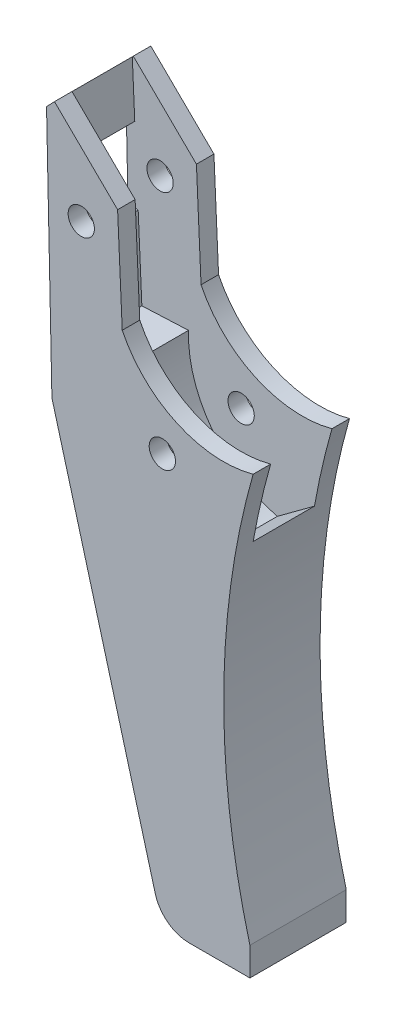
ISO-10303-21;
HEADER;
FILE_DESCRIPTION(('STEP AP214'),'2;1');
FILE_NAME('part.step','',(''),(''),'','','');
FILE_SCHEMA(('AUTOMOTIVE_DESIGN { 1 0 10303 214 1 1 1 1 }'));
ENDSEC;
DATA;
#1=APPLICATION_CONTEXT('core data for automotive mechanical design processes');
#2=APPLICATION_PROTOCOL_DEFINITION('international standard','automotive_design',2000,#1);
#3=PRODUCT_CONTEXT('',#1,'mechanical');
#4=PRODUCT('Part','Part','',(#3));
#5=PRODUCT_RELATED_PRODUCT_CATEGORY('part','',(#4));
#6=PRODUCT_DEFINITION_FORMATION('','',#4);
#7=PRODUCT_DEFINITION_CONTEXT('part definition',#1,'design');
#8=PRODUCT_DEFINITION('design','',#6,#7);
#9=PRODUCT_DEFINITION_SHAPE('','',#8);
#10=(LENGTH_UNIT() NAMED_UNIT(*) SI_UNIT(.MILLI.,.METRE.));
#11=(NAMED_UNIT(*) PLANE_ANGLE_UNIT() SI_UNIT($,.RADIAN.));
#12=(NAMED_UNIT(*) SI_UNIT($,.STERADIAN.) SOLID_ANGLE_UNIT());
#13=UNCERTAINTY_MEASURE_WITH_UNIT(LENGTH_MEASURE(1.E-05),#10,'distance_accuracy_value','');
#14=(GEOMETRIC_REPRESENTATION_CONTEXT(3) GLOBAL_UNCERTAINTY_ASSIGNED_CONTEXT((#13)) GLOBAL_UNIT_ASSIGNED_CONTEXT((#10,
#11,#12)) REPRESENTATION_CONTEXT('',''));
#15=CARTESIAN_POINT('',(0.,0.,0.));
#16=DIRECTION('',(0.,0.,1.));
#17=DIRECTION('',(1.,0.,0.));
#18=AXIS2_PLACEMENT_3D('',#15,#16,#17);
#19=CARTESIAN_POINT('',(-93.851998144766,-4.25439327758758,0.));
#20=DIRECTION('',(-0.998974136602221,-0.0452843725787139,0.));
#21=DIRECTION('',(0.0452843725787139,-0.998974136602221,0.));
#22=AXIS2_PLACEMENT_3D('',#19,#20,#21);
#23=PLANE('',#22);
#24=DIRECTION('',(0.,0.,-1.));
#25=VECTOR('',#24,1.);
#26=CARTESIAN_POINT('',(-92.0932753415327,-43.0518523972579,-6.98499999999999));
#27=LINE('',#26,#25);
#28=CARTESIAN_POINT('',(-92.0932753287063,-43.0518523932482,-11.43));
#29=VERTEX_POINT('',#28);
#30=CARTESIAN_POINT('',(-92.0932753416877,-43.0518523938367,-2.54));
#31=VERTEX_POINT('',#30);
#32=EDGE_CURVE('E12',#29,#31,#27,.F.);
#33=ORIENTED_EDGE('',*,*,#32,.F.);
#34=DIRECTION('',(-0.0452843725787139,0.998974136602221,0.));
#35=VECTOR('',#34,1.);
#36=CARTESIAN_POINT('',(-91.6881256823312,-51.9894617301897,-11.43));
#37=LINE('',#36,#35);
#38=CARTESIAN_POINT('',(-92.4528064360996,-35.1205894841561,-11.43));
#39=VERTEX_POINT('',#38);
#40=EDGE_CURVE('E260',#29,#39,#37,.T.);
#41=ORIENTED_EDGE('',*,*,#40,.T.);
#42=DIRECTION('',(0.,0.,-1.));
#43=VECTOR('',#42,1.);
#44=CARTESIAN_POINT('',(-92.4528064360996,-35.1205894841561,-13.97));
#45=LINE('',#44,#43);
#46=CARTESIAN_POINT('',(-92.4528064360996,-35.1205894841561,-2.54));
#47=VERTEX_POINT('',#46);
#48=EDGE_CURVE('E371',#39,#47,#45,.F.);
#49=ORIENTED_EDGE('',*,*,#48,.T.);
#50=DIRECTION('',(0.0452843725787139,-0.998974136602221,0.));
#51=VECTOR('',#50,1.);
#52=CARTESIAN_POINT('',(-91.6881256823312,-51.9894617301897,-2.54));
#53=LINE('',#52,#51);
#54=EDGE_CURVE('E261',#47,#31,#53,.T.);
#55=ORIENTED_EDGE('',*,*,#54,.T.);
#56=EDGE_LOOP('',(#33,#41,#49,#55));
#57=FACE_BOUND('',#56,.T.);
#58=ADVANCED_FACE('F36',(#57),#23,.F.);
#59=DIRECTION('',(0.,0.,-1.));
#60=VECTOR('',#59,1.);
#61=CARTESIAN_POINT('',(-91.5990378742872,-53.9547405019692,-6.98499999999999));
#62=LINE('',#61,#60);
#63=CARTESIAN_POINT('',(-91.5990378742848,-53.9547405019693,-2.54));
#64=VERTEX_POINT('',#63);
#65=CARTESIAN_POINT('',(-91.5990378742848,-53.9547405019693,-11.43));
#66=VERTEX_POINT('',#65);
#67=EDGE_CURVE('E45',#64,#66,#62,.T.);
#68=ORIENTED_EDGE('',*,*,#67,.F.);
#69=CARTESIAN_POINT('',(-91.0660692775769,-65.7120380732134,-2.54));
#70=VERTEX_POINT('',#69);
#71=EDGE_CURVE('E259',#64,#70,#53,.T.);
#72=ORIENTED_EDGE('',*,*,#71,.T.);
#73=DIRECTION('',(0.,0.,-1.));
#74=VECTOR('',#73,1.);
#75=CARTESIAN_POINT('',(-91.0660692775769,-65.7120380732134,-11.43));
#76=LINE('',#75,#74);
#77=CARTESIAN_POINT('',(-91.0660692775769,-65.7120380732134,-11.43));
#78=VERTEX_POINT('',#77);
#79=EDGE_CURVE('E263',#70,#78,#76,.T.);
#80=ORIENTED_EDGE('',*,*,#79,.T.);
#81=EDGE_CURVE('E256',#78,#66,#37,.T.);
#82=ORIENTED_EDGE('',*,*,#81,.T.);
#83=EDGE_LOOP('',(#68,#72,#80,#82));
#84=FACE_BOUND('',#83,.T.);
#85=ADVANCED_FACE('F393',(#84),#23,.F.);
#86=CARTESIAN_POINT('',(-93.5093838514776,-33.7907250637819,-13.97));
#87=DIRECTION('',(0.700655916393488,0.713499325033178,0.));
#88=DIRECTION('',(-0.713499325033178,0.700655916393488,0.));
#89=AXIS2_PLACEMENT_3D('',#86,#87,#88);
#90=PLANE('',#89);
#91=DIRECTION('',(-0.713499325033178,0.700655916393488,0.));
#92=VECTOR('',#91,1.);
#93=CARTESIAN_POINT('',(-93.5093838514776,-33.7907250637819,-13.97));
#94=LINE('',#93,#92);
#95=CARTESIAN_POINT('',(-83.1529453065732,-43.9607416071269,-13.97));
#96=VERTEX_POINT('',#95);
#97=CARTESIAN_POINT('',(-92.3085324636097,-34.9699604184613,-13.97));
#98=VERTEX_POINT('',#97);
#99=EDGE_CURVE('E302',#96,#98,#94,.T.);
#100=ORIENTED_EDGE('',*,*,#99,.T.);
#101=DIRECTION('',(0.,0.,1.));
#102=VECTOR('',#101,1.);
#103=CARTESIAN_POINT('',(-92.3085324636097,-34.9699604184613,-13.97));
#104=LINE('',#103,#102);
#105=CARTESIAN_POINT('',(-92.3085324636097,-34.9699604184613,-11.43));
#106=VERTEX_POINT('',#105);
#107=EDGE_CURVE('E365',#98,#106,#104,.T.);
#108=ORIENTED_EDGE('',*,*,#107,.T.);
#109=DIRECTION('',(-0.713499325033178,0.700655916393488,0.));
#110=VECTOR('',#109,1.);
#111=CARTESIAN_POINT('',(-93.5093838514776,-33.7907250637819,-11.43));
#112=LINE('',#111,#110);
#113=CARTESIAN_POINT('',(-83.1529453065732,-43.9607416071269,-11.43));
#114=VERTEX_POINT('',#113);
#115=EDGE_CURVE('E247',#114,#106,#112,.T.);
#116=ORIENTED_EDGE('',*,*,#115,.F.);
#117=DIRECTION('',(0.,0.,1.));
#118=VECTOR('',#117,1.);
#119=CARTESIAN_POINT('',(-83.1529453065732,-43.9607416071269,-13.97));
#120=LINE('',#119,#118);
#121=EDGE_CURVE('E340',#96,#114,#120,.T.);
#122=ORIENTED_EDGE('',*,*,#121,.F.);
#123=EDGE_LOOP('',(#100,#108,#116,#122));
#124=FACE_BOUND('',#123,.T.);
#125=ADVANCED_FACE('F426',(#124),#90,.T.);
#126=CARTESIAN_POINT('',(-67.7974577544725,-51.5892197136728,-13.97));
#127=DIRECTION('',(0.,0.,1.));
#128=DIRECTION('',(1.,0.,0.));
#129=AXIS2_PLACEMENT_3D('',#126,#127,#128);
#130=CYLINDRICAL_SURFACE('',#129,16.3454628496922);
#131=DIRECTION('',(0.,0.,1.));
#132=VECTOR('',#131,1.);
#133=CARTESIAN_POINT('',(-82.4816784910541,-58.7689005652159,-13.97));
#134=LINE('',#133,#132);
#135=CARTESIAN_POINT('',(-82.4816784910541,-58.7689005652159,-13.97));
#136=VERTEX_POINT('',#135);
#137=CARTESIAN_POINT('',(-82.4816784910541,-58.7689005652159,-11.43));
#138=VERTEX_POINT('',#137);
#139=EDGE_CURVE('E344',#136,#138,#134,.T.);
#140=ORIENTED_EDGE('',*,*,#139,.T.);
#141=CARTESIAN_POINT('',(-67.7974577544725,-51.5892197136728,-11.43));
#142=DIRECTION('',(0.,0.,1.));
#143=DIRECTION('',(1.,0.,0.));
#144=AXIS2_PLACEMENT_3D('',#141,#142,#143);
#145=CIRCLE('',#144,16.3454628496922);
#146=CARTESIAN_POINT('',(-63.5,-67.3596354538868,-11.43));
#147=VERTEX_POINT('',#146);
#148=EDGE_CURVE('E232',#138,#147,#145,.T.);
#149=ORIENTED_EDGE('',*,*,#148,.T.);
#150=DIRECTION('',(0.,0.,1.));
#151=VECTOR('',#150,1.);
#152=CARTESIAN_POINT('',(-63.5,-67.3596354538868,-13.97));
#153=LINE('',#152,#151);
#154=CARTESIAN_POINT('',(-63.5,-67.3596354538868,-13.97));
#155=VERTEX_POINT('',#154);
#156=EDGE_CURVE('E348',#155,#147,#153,.T.);
#157=ORIENTED_EDGE('',*,*,#156,.F.);
#158=CARTESIAN_POINT('',(-67.7974577544725,-51.5892197136728,-13.97));
#159=DIRECTION('',(0.,0.,-1.));
#160=DIRECTION('',(-1.,0.,0.));
#161=AXIS2_PLACEMENT_3D('',#158,#159,#160);
#162=CIRCLE('',#161,16.3454628496922);
#163=EDGE_CURVE('E296',#155,#136,#162,.T.);
#164=ORIENTED_EDGE('',*,*,#163,.T.);
#165=EDGE_LOOP('',(#140,#149,#157,#164));
#166=FACE_BOUND('',#165,.T.);
#167=ADVANCED_FACE('F413',(#166),#130,.F.);
#168=CARTESIAN_POINT('',(43.7733812356117,-97.8979837956197,-13.97));
#169=DIRECTION('',(0.,0.,1.));
#170=DIRECTION('',(1.,0.,0.));
#171=AXIS2_PLACEMENT_3D('',#168,#169,#170);
#172=CYLINDRICAL_SURFACE('',#171,111.535505742171);
#173=ORIENTED_EDGE('',*,*,#156,.T.);
#174=CARTESIAN_POINT('',(43.7733812356117,-97.8979837956197,-11.43));
#175=DIRECTION('',(0.,0.,1.));
#176=DIRECTION('',(1.,0.,0.));
#177=AXIS2_PLACEMENT_3D('',#174,#175,#176);
#178=CIRCLE('',#177,111.535505742171);
#179=CARTESIAN_POINT('',(-66.0356185174837,-78.3492596841434,-11.43));
#180=VERTEX_POINT('',#179);
#181=EDGE_CURVE('E235',#147,#180,#178,.T.);
#182=ORIENTED_EDGE('',*,*,#181,.T.);
#183=DIRECTION('',(0.,0.,1.));
#184=VECTOR('',#183,1.);
#185=CARTESIAN_POINT('',(-66.0356185174837,-78.3492596841434,-13.97));
#186=LINE('',#185,#184);
#187=CARTESIAN_POINT('',(-66.0356185174837,-78.3492596841434,-2.54));
#188=VERTEX_POINT('',#187);
#189=EDGE_CURVE('E336',#188,#180,#186,.F.);
#190=ORIENTED_EDGE('',*,*,#189,.F.);
#191=CARTESIAN_POINT('',(43.7733812356117,-97.8979837956197,-2.54));
#192=DIRECTION('',(0.,0.,1.));
#193=DIRECTION('',(1.,0.,0.));
#194=AXIS2_PLACEMENT_3D('',#191,#192,#193);
#195=CIRCLE('',#194,111.535505742171);
#196=CARTESIAN_POINT('',(-63.5,-67.3596354538868,-2.54));
#197=VERTEX_POINT('',#196);
#198=EDGE_CURVE('E227',#197,#188,#195,.T.);
#199=ORIENTED_EDGE('',*,*,#198,.F.);
#200=CARTESIAN_POINT('',(-63.5,-67.3596354538868,0.));
#201=VERTEX_POINT('',#200);
#202=EDGE_CURVE('E351',#197,#201,#153,.T.);
#203=ORIENTED_EDGE('',*,*,#202,.T.);
#204=CARTESIAN_POINT('',(43.7733812356117,-97.8979837956197,0.));
#205=DIRECTION('',(0.,0.,-1.));
#206=DIRECTION('',(-1.,0.,0.));
#207=AXIS2_PLACEMENT_3D('',#204,#205,#206);
#208=CIRCLE('',#207,111.535505742171);
#209=CARTESIAN_POINT('',(-63.9670604737335,-126.745275894482,0.));
#210=VERTEX_POINT('',#209);
#211=EDGE_CURVE('E315',#210,#201,#208,.T.);
#212=ORIENTED_EDGE('',*,*,#211,.F.);
#213=DIRECTION('',(0.,0.,1.));
#214=VECTOR('',#213,1.);
#215=CARTESIAN_POINT('',(-63.9670604737335,-126.745275894482,-13.97));
#216=LINE('',#215,#214);
#217=CARTESIAN_POINT('',(-63.9670604737335,-126.745275894482,-13.97));
#218=VERTEX_POINT('',#217);
#219=EDGE_CURVE('E312',#218,#210,#216,.T.);
#220=ORIENTED_EDGE('',*,*,#219,.F.);
#221=CARTESIAN_POINT('',(43.7733812356117,-97.8979837956197,-13.97));
#222=DIRECTION('',(0.,0.,-1.));
#223=DIRECTION('',(-1.,0.,0.));
#224=AXIS2_PLACEMENT_3D('',#221,#222,#223);
#225=CIRCLE('',#224,111.535505742171);
#226=EDGE_CURVE('E292',#218,#155,#225,.T.);
#227=ORIENTED_EDGE('',*,*,#226,.T.);
#228=EDGE_LOOP('',(#173,#182,#190,#199,#203,#212,#220,#227));
#229=FACE_BOUND('',#228,.T.);
#230=ADVANCED_FACE('F409',(#229),#172,.F.);
#231=CARTESIAN_POINT('',(-76.6670604737335,-71.3707090497414,-13.97));
#232=DIRECTION('',(0.,0.,1.));
#233=DIRECTION('',(1.,0.,0.));
#234=AXIS2_PLACEMENT_3D('',#231,#232,#233);
#235=CYLINDRICAL_SURFACE('',#234,1.90500000000001);
#236=CARTESIAN_POINT('',(-76.6670604737335,-71.3707090497414,-13.97));
#237=DIRECTION('',(0.,0.,1.));
#238=DIRECTION('',(1.,0.,0.));
#239=AXIS2_PLACEMENT_3D('',#236,#237,#238);
#240=CIRCLE('',#239,1.90500000000001);
#241=CARTESIAN_POINT('',(-74.7620604737335,-71.3707090497414,-13.97));
#242=VERTEX_POINT('',#241);
#243=EDGE_CURVE('E283',#242,#242,#240,.T.);
#244=ORIENTED_EDGE('',*,*,#243,.F.);
#245=EDGE_LOOP('',(#244));
#246=FACE_BOUND('',#245,.T.);
#247=CARTESIAN_POINT('',(-76.6670604737335,-71.3707090497414,-11.43));
#248=DIRECTION('',(0.,0.,1.));
#249=DIRECTION('',(1.,0.,0.));
#250=AXIS2_PLACEMENT_3D('',#247,#248,#249);
#251=CIRCLE('',#250,1.90500000000001);
#252=CARTESIAN_POINT('',(-74.7620604737335,-71.3707090497414,-11.43));
#253=VERTEX_POINT('',#252);
#254=EDGE_CURVE('E238',#253,#253,#251,.F.);
#255=ORIENTED_EDGE('',*,*,#254,.F.);
#256=EDGE_LOOP('',(#255));
#257=FACE_BOUND('',#256,.T.);
#258=ADVANCED_FACE('F506',(#246,#257),#235,.F.);
#259=CARTESIAN_POINT('',(-83.1529453065732,-43.9607416071269,-13.97));
#260=DIRECTION('',(0.998974136602221,0.0452843725787153,0.));
#261=DIRECTION('',(-0.0452843725787153,0.998974136602221,0.));
#262=AXIS2_PLACEMENT_3D('',#259,#260,#261);
#263=PLANE('',#262);
#264=DIRECTION('',(0.0452843725787139,-0.998974136602221,0.));
#265=VECTOR('',#264,1.);
#266=CARTESIAN_POINT('',(-82.8072456079375,-51.5868836579649,-2.54));
#267=LINE('',#266,#265);
#268=CARTESIAN_POINT('',(-83.1529453065732,-43.9607416071269,-2.54));
#269=VERTEX_POINT('',#268);
#270=CARTESIAN_POINT('',(-82.4816784910541,-58.7689005652159,-2.54));
#271=VERTEX_POINT('',#270);
#272=EDGE_CURVE('E268',#269,#271,#267,.T.);
#273=ORIENTED_EDGE('',*,*,#272,.F.);
#274=CARTESIAN_POINT('',(-83.1529453065732,-43.9607416071269,0.));
#275=VERTEX_POINT('',#274);
#276=EDGE_CURVE('E343',#269,#275,#120,.T.);
#277=ORIENTED_EDGE('',*,*,#276,.T.);
#278=DIRECTION('',(-0.0452843725787153,0.998974136602221,0.));
#279=VECTOR('',#278,1.);
#280=CARTESIAN_POINT('',(-83.1529453065732,-43.9607416071269,0.));
#281=LINE('',#280,#279);
#282=CARTESIAN_POINT('',(-82.4816784910541,-58.7689005652159,0.));
#283=VERTEX_POINT('',#282);
#284=EDGE_CURVE('E321',#283,#275,#281,.T.);
#285=ORIENTED_EDGE('',*,*,#284,.F.);
#286=EDGE_CURVE('E347',#271,#283,#134,.T.);
#287=ORIENTED_EDGE('',*,*,#286,.F.);
#288=EDGE_LOOP('',(#273,#277,#285,#287));
#289=FACE_BOUND('',#288,.T.);
#290=ADVANCED_FACE('F449',(#289),#263,.T.);
#291=CARTESIAN_POINT('',(-88.4240724531365,-48.0537853711645,-13.97));
#292=DIRECTION('',(0.,0.,1.));
#293=DIRECTION('',(1.,0.,0.));
#294=AXIS2_PLACEMENT_3D('',#291,#292,#293);
#295=CYLINDRICAL_SURFACE('',#294,1.90500000000001);
#296=CARTESIAN_POINT('',(-88.4240724531365,-48.0537853711645,-2.54));
#297=DIRECTION('',(0.,0.,1.));
#298=DIRECTION('',(1.,0.,0.));
#299=AXIS2_PLACEMENT_3D('',#296,#297,#298);
#300=CIRCLE('',#299,1.90500000000001);
#301=CARTESIAN_POINT('',(-86.5190724531365,-48.0537853711645,-2.54));
#302=VERTEX_POINT('',#301);
#303=EDGE_CURVE('E250',#302,#302,#300,.F.);
#304=ORIENTED_EDGE('',*,*,#303,.T.);
#305=EDGE_LOOP('',(#304));
#306=FACE_BOUND('',#305,.T.);
#307=CARTESIAN_POINT('',(-88.4240724531365,-48.0537853711645,0.));
#308=DIRECTION('',(0.,0.,1.));
#309=DIRECTION('',(1.,0.,0.));
#310=AXIS2_PLACEMENT_3D('',#307,#308,#309);
#311=CIRCLE('',#310,1.90500000000001);
#312=CARTESIAN_POINT('',(-86.5190724531365,-48.0537853711645,0.));
#313=VERTEX_POINT('',#312);
#314=EDGE_CURVE('E274',#313,#313,#311,.T.);
#315=ORIENTED_EDGE('',*,*,#314,.T.);
#316=EDGE_LOOP('',(#315));
#317=FACE_BOUND('',#316,.T.);
#318=ADVANCED_FACE('F502',(#306,#317),#295,.F.);
#319=CARTESIAN_POINT('',(-63.9670604737335,-130.859635453887,-13.97));
#320=DIRECTION('',(1.,0.,0.));
#321=DIRECTION('',(0.,0.,-1.));
#322=AXIS2_PLACEMENT_3D('',#319,#320,#321);
#323=PLANE('',#322);
#324=DIRECTION('',(0.,1.,0.));
#325=VECTOR('',#324,1.);
#326=CARTESIAN_POINT('',(-63.9670604737335,-130.859635453887,0.));
#327=LINE('',#326,#325);
#328=CARTESIAN_POINT('',(-63.9670604737335,-130.859635453887,0.));
#329=VERTEX_POINT('',#328);
#330=EDGE_CURVE('E286',#329,#210,#327,.T.);
#331=ORIENTED_EDGE('',*,*,#330,.F.);
#332=DIRECTION('',(0.,0.,1.));
#333=VECTOR('',#332,1.);
#334=CARTESIAN_POINT('',(-63.9670604737335,-130.859635453887,-13.97));
#335=LINE('',#334,#333);
#336=CARTESIAN_POINT('',(-63.9670604737335,-130.859635453887,-13.97));
#337=VERTEX_POINT('',#336);
#338=EDGE_CURVE('E333',#337,#329,#335,.T.);
#339=ORIENTED_EDGE('',*,*,#338,.F.);
#340=DIRECTION('',(0.,1.,0.));
#341=VECTOR('',#340,1.);
#342=CARTESIAN_POINT('',(-63.9670604737335,-130.859635453887,-13.97));
#343=LINE('',#342,#341);
#344=EDGE_CURVE('E289',#337,#218,#343,.T.);
#345=ORIENTED_EDGE('',*,*,#344,.T.);
#346=ORIENTED_EDGE('',*,*,#219,.T.);
#347=EDGE_LOOP('',(#331,#339,#345,#346));
#348=FACE_BOUND('',#347,.T.);
#349=ADVANCED_FACE('F457',(#348),#323,.T.);
#350=CARTESIAN_POINT('',(-63.9670604737335,-130.859635453887,-13.97));
#351=DIRECTION('',(0.,-1.,0.));
#352=DIRECTION('',(0.,0.,-1.));
#353=AXIS2_PLACEMENT_3D('',#350,#351,#352);
#354=PLANE('',#353);
#355=DIRECTION('',(1.,0.,0.));
#356=VECTOR('',#355,1.);
#357=CARTESIAN_POINT('',(-63.9670604737335,-130.859635453887,0.));
#358=LINE('',#357,#356);
#359=CARTESIAN_POINT('',(-72.790672129976,-130.859635453887,0.));
#360=VERTEX_POINT('',#359);
#361=EDGE_CURVE('E293',#360,#329,#358,.T.);
#362=ORIENTED_EDGE('',*,*,#361,.F.);
#363=DIRECTION('',(0.,0.,1.));
#364=VECTOR('',#363,1.);
#365=CARTESIAN_POINT('',(-72.790672129976,-130.859635453887,-13.97));
#366=LINE('',#365,#364);
#367=CARTESIAN_POINT('',(-72.790672129976,-130.859635453887,-13.97));
#368=VERTEX_POINT('',#367);
#369=EDGE_CURVE('E359',#360,#368,#366,.F.);
#370=ORIENTED_EDGE('',*,*,#369,.T.);
#371=DIRECTION('',(1.,0.,0.));
#372=VECTOR('',#371,1.);
#373=CARTESIAN_POINT('',(-63.9670604737335,-130.859635453887,-13.97));
#374=LINE('',#373,#372);
#375=EDGE_CURVE('E310',#368,#337,#374,.T.);
#376=ORIENTED_EDGE('',*,*,#375,.T.);
#377=ORIENTED_EDGE('',*,*,#338,.T.);
#378=EDGE_LOOP('',(#362,#370,#376,#377));
#379=FACE_BOUND('',#378,.T.);
#380=ADVANCED_FACE('F480',(#379),#354,.T.);
#381=CARTESIAN_POINT('',(-76.6670604737335,-130.859635453887,-13.97));
#382=DIRECTION('',(-0.96452162245179,-0.264003863272805,0.));
#383=DIRECTION('',(0.264003863272805,-0.96452162245179,0.));
#384=AXIS2_PLACEMENT_3D('',#381,#382,#383);
#385=PLANE('',#384);
#386=DIRECTION('',(0.264003863272805,-0.96452162245179,0.));
#387=VECTOR('',#386,1.);
#388=CARTESIAN_POINT('',(-76.6670604737335,-130.859635453887,-13.97));
#389=LINE('',#388,#387);
#390=CARTESIAN_POINT('',(-92.6781347904369,-72.3641756310693,-13.97));
#391=VERTEX_POINT('',#390);
#392=CARTESIAN_POINT('',(-77.6904419720311,-127.120775079313,-13.97));
#393=VERTEX_POINT('',#392);
#394=EDGE_CURVE('E307',#391,#393,#389,.T.);
#395=ORIENTED_EDGE('',*,*,#394,.T.);
#396=DIRECTION('',(0.,0.,1.));
#397=VECTOR('',#396,1.);
#398=CARTESIAN_POINT('',(-77.6904419720311,-127.120775079313,-13.97));
#399=LINE('',#398,#397);
#400=CARTESIAN_POINT('',(-77.6904419720311,-127.120775079313,0.));
#401=VERTEX_POINT('',#400);
#402=EDGE_CURVE('E354',#393,#401,#399,.T.);
#403=ORIENTED_EDGE('',*,*,#402,.T.);
#404=DIRECTION('',(0.264003863272805,-0.96452162245179,0.));
#405=VECTOR('',#404,1.);
#406=CARTESIAN_POINT('',(-76.6670604737335,-130.859635453887,0.));
#407=LINE('',#406,#405);
#408=CARTESIAN_POINT('',(-92.6781347904369,-72.3641756310693,0.));
#409=VERTEX_POINT('',#408);
#410=EDGE_CURVE('E329',#409,#401,#407,.T.);
#411=ORIENTED_EDGE('',*,*,#410,.F.);
#412=DIRECTION('',(0.,0.,1.));
#413=VECTOR('',#412,1.);
#414=CARTESIAN_POINT('',(-92.6781347904369,-72.3641756310693,-13.97));
#415=LINE('',#414,#413);
#416=EDGE_CURVE('E337',#391,#409,#415,.T.);
#417=ORIENTED_EDGE('',*,*,#416,.F.);
#418=EDGE_LOOP('',(#395,#403,#411,#417));
#419=FACE_BOUND('',#418,.T.);
#420=ADVANCED_FACE('F469',(#419),#385,.T.);
#421=CARTESIAN_POINT('',(-92.6781347904369,-72.3641756310693,-13.97));
#422=DIRECTION('',(-0.999767884506996,-0.0215447698619914,0.));
#423=DIRECTION('',(0.0215447698619914,-0.999767884506996,0.));
#424=AXIS2_PLACEMENT_3D('',#421,#422,#423);
#425=PLANE('',#424);
#426=DIRECTION('',(0.0215447698619914,-0.999767884506996,0.));
#427=VECTOR('',#426,1.);
#428=CARTESIAN_POINT('',(-92.6781347904369,-72.3641756310693,-11.43));
#429=LINE('',#428,#427);
#430=CARTESIAN_POINT('',(-93.2909177776818,-43.9284688969299,-11.43));
#431=VERTEX_POINT('',#430);
#432=CARTESIAN_POINT('',(-93.092711695722,-53.126064124241,-11.43));
#433=VERTEX_POINT('',#432);
#434=EDGE_CURVE('E195',#431,#433,#429,.T.);
#435=ORIENTED_EDGE('',*,*,#434,.F.);
#436=DIRECTION('',(0.,0.,-1.));
#437=VECTOR('',#436,1.);
#438=CARTESIAN_POINT('',(-93.2909177841511,-43.9284689044784,-6.98499999999999));
#439=LINE('',#438,#437);
#440=CARTESIAN_POINT('',(-93.2909177776818,-43.9284688969299,-2.54));
#441=VERTEX_POINT('',#440);
#442=EDGE_CURVE('E199',#431,#441,#439,.F.);
#443=ORIENTED_EDGE('',*,*,#442,.T.);
#444=DIRECTION('',(-0.0215447698619914,0.999767884506996,0.));
#445=VECTOR('',#444,1.);
#446=CARTESIAN_POINT('',(-92.6781347904369,-72.3641756310693,-2.54));
#447=LINE('',#446,#445);
#448=CARTESIAN_POINT('',(-93.0927117051514,-53.1260641244442,-2.54));
#449=VERTEX_POINT('',#448);
#450=EDGE_CURVE('E189',#449,#441,#447,.T.);
#451=ORIENTED_EDGE('',*,*,#450,.F.);
#452=DIRECTION('',(0.,0.,-1.));
#453=VECTOR('',#452,1.);
#454=CARTESIAN_POINT('',(-93.09271170537,-53.1260641143017,-6.98499999999999));
#455=LINE('',#454,#453);
#456=EDGE_CURVE('E208',#449,#433,#455,.T.);
#457=ORIENTED_EDGE('',*,*,#456,.T.);
#458=EDGE_LOOP('',(#435,#443,#451,#457));
#459=FACE_BOUND('',#458,.T.);
#460=DIRECTION('',(0.0215447698619914,-0.999767884506996,0.));
#461=VECTOR('',#460,1.);
#462=CARTESIAN_POINT('',(-92.6781347904369,-72.3641756310693,0.));
#463=LINE('',#462,#461);
#464=CARTESIAN_POINT('',(-93.4581072992061,-36.1701726289086,0.));
#465=VERTEX_POINT('',#464);
#466=EDGE_CURVE('E327',#465,#409,#463,.T.);
#467=ORIENTED_EDGE('',*,*,#466,.F.);
#468=DIRECTION('',(0.,0.,-1.));
#469=VECTOR('',#468,1.);
#470=CARTESIAN_POINT('',(-93.4581072992061,-36.1701726289086,-13.97));
#471=LINE('',#470,#469);
#472=CARTESIAN_POINT('',(-93.4581072992061,-36.1701726289086,-13.97));
#473=VERTEX_POINT('',#472);
#474=EDGE_CURVE('E377',#465,#473,#471,.T.);
#475=ORIENTED_EDGE('',*,*,#474,.T.);
#476=DIRECTION('',(0.0215447698619914,-0.999767884506996,0.));
#477=VECTOR('',#476,1.);
#478=CARTESIAN_POINT('',(-92.6781347904369,-72.3641756310693,-13.97));
#479=LINE('',#478,#477);
#480=EDGE_CURVE('E305',#473,#391,#479,.T.);
#481=ORIENTED_EDGE('',*,*,#480,.T.);
#482=ORIENTED_EDGE('',*,*,#416,.T.);
#483=EDGE_LOOP('',(#467,#475,#481,#482));
#484=FACE_BOUND('',#483,.T.);
#485=ADVANCED_FACE('F205',(#459,#484),#425,.T.);
#486=DIRECTION('',(0.713499325033178,-0.700655916393488,0.));
#487=VECTOR('',#486,1.);
#488=CARTESIAN_POINT('',(-93.5093838514776,-33.7907250637819,-2.54));
#489=LINE('',#488,#487);
#490=CARTESIAN_POINT('',(-92.3085324636097,-34.9699604184613,-2.54));
#491=VERTEX_POINT('',#490);
#492=EDGE_CURVE('E253',#491,#269,#489,.T.);
#493=ORIENTED_EDGE('',*,*,#492,.F.);
#494=DIRECTION('',(0.,0.,1.));
#495=VECTOR('',#494,1.);
#496=CARTESIAN_POINT('',(-92.3085324636097,-34.9699604184613,-13.97));
#497=LINE('',#496,#495);
#498=CARTESIAN_POINT('',(-92.3085324636097,-34.9699604184613,0.));
#499=VERTEX_POINT('',#498);
#500=EDGE_CURVE('E363',#491,#499,#497,.T.);
#501=ORIENTED_EDGE('',*,*,#500,.T.);
#502=DIRECTION('',(-0.713499325033178,0.700655916393488,0.));
#503=VECTOR('',#502,1.);
#504=CARTESIAN_POINT('',(-93.5093838514776,-33.7907250637819,0.));
#505=LINE('',#504,#503);
#506=EDGE_CURVE('E324',#275,#499,#505,.T.);
#507=ORIENTED_EDGE('',*,*,#506,.F.);
#508=ORIENTED_EDGE('',*,*,#276,.F.);
#509=EDGE_LOOP('',(#493,#501,#507,#508));
#510=FACE_BOUND('',#509,.T.);
#511=ADVANCED_FACE('F439',(#510),#90,.T.);
#512=ORIENTED_EDGE('',*,*,#121,.T.);
#513=DIRECTION('',(-0.0452843725787139,0.998974136602221,0.));
#514=VECTOR('',#513,1.);
#515=CARTESIAN_POINT('',(-82.8072456079375,-51.5868836579649,-11.43));
#516=LINE('',#515,#514);
#517=EDGE_CURVE('E255',#138,#114,#516,.T.);
#518=ORIENTED_EDGE('',*,*,#517,.F.);
#519=ORIENTED_EDGE('',*,*,#139,.F.);
#520=DIRECTION('',(-0.0452843725787153,0.998974136602221,0.));
#521=VECTOR('',#520,1.);
#522=CARTESIAN_POINT('',(-83.1529453065732,-43.9607416071269,-13.97));
#523=LINE('',#522,#521);
#524=EDGE_CURVE('E299',#136,#96,#523,.T.);
#525=ORIENTED_EDGE('',*,*,#524,.T.);
#526=EDGE_LOOP('',(#512,#518,#519,#525));
#527=FACE_BOUND('',#526,.T.);
#528=ADVANCED_FACE('F417',(#527),#263,.T.);
#529=CARTESIAN_POINT('',(-67.7974577544725,-51.5892197136728,-2.54));
#530=DIRECTION('',(0.,0.,1.));
#531=DIRECTION('',(1.,0.,0.));
#532=AXIS2_PLACEMENT_3D('',#529,#530,#531);
#533=CIRCLE('',#532,16.3454628496922);
#534=EDGE_CURVE('E225',#271,#197,#533,.T.);
#535=ORIENTED_EDGE('',*,*,#534,.F.);
#536=ORIENTED_EDGE('',*,*,#286,.T.);
#537=CARTESIAN_POINT('',(-67.7974577544725,-51.5892197136728,0.));
#538=DIRECTION('',(0.,0.,-1.));
#539=DIRECTION('',(-1.,0.,0.));
#540=AXIS2_PLACEMENT_3D('',#537,#538,#539);
#541=CIRCLE('',#540,16.3454628496922);
#542=EDGE_CURVE('E318',#201,#283,#541,.T.);
#543=ORIENTED_EDGE('',*,*,#542,.F.);
#544=ORIENTED_EDGE('',*,*,#202,.F.);
#545=EDGE_LOOP('',(#535,#536,#543,#544));
#546=FACE_BOUND('',#545,.T.);
#547=ADVANCED_FACE('F451',(#546),#130,.F.);
#548=CARTESIAN_POINT('',(43.7733812356117,-97.8979837956197,-13.97));
#549=DIRECTION('',(0.,0.,-1.));
#550=DIRECTION('',(-1.,0.,0.));
#551=AXIS2_PLACEMENT_3D('',#548,#549,#550);
#552=PLANE('',#551);
#553=CARTESIAN_POINT('',(-88.4240724531365,-48.0537853711645,-13.97));
#554=DIRECTION('',(0.,0.,1.));
#555=DIRECTION('',(1.,0.,0.));
#556=AXIS2_PLACEMENT_3D('',#553,#554,#555);
#557=CIRCLE('',#556,1.90500000000001);
#558=CARTESIAN_POINT('',(-86.5190724531365,-48.0537853711645,-13.97));
#559=VERTEX_POINT('',#558);
#560=EDGE_CURVE('E277',#559,#559,#557,.T.);
#561=ORIENTED_EDGE('',*,*,#560,.T.);
#562=EDGE_LOOP('',(#561));
#563=FACE_BOUND('',#562,.T.);
#564=ORIENTED_EDGE('',*,*,#243,.T.);
#565=EDGE_LOOP('',(#564));
#566=FACE_BOUND('',#565,.T.);
#567=ORIENTED_EDGE('',*,*,#480,.F.);
#568=DIRECTION('',(-0.691708197878913,-0.722177103615939,0.));
#569=VECTOR('',#568,1.);
#570=CARTESIAN_POINT('',(-58.6335505390539,0.188363547003689,-13.97));
#571=LINE('',#570,#569);
#572=EDGE_CURVE('E379',#473,#98,#571,.F.);
#573=ORIENTED_EDGE('',*,*,#572,.T.);
#574=ORIENTED_EDGE('',*,*,#99,.F.);
#575=ORIENTED_EDGE('',*,*,#524,.F.);
#576=ORIENTED_EDGE('',*,*,#163,.F.);
#577=ORIENTED_EDGE('',*,*,#226,.F.);
#578=ORIENTED_EDGE('',*,*,#344,.F.);
#579=ORIENTED_EDGE('',*,*,#375,.F.);
#580=CARTESIAN_POINT('',(-72.790672129976,-125.779635453887,-13.97));
#581=DIRECTION('',(0.,0.,-1.));
#582=DIRECTION('',(-1.,0.,0.));
#583=AXIS2_PLACEMENT_3D('',#580,#581,#582);
#584=CIRCLE('',#583,5.08);
#585=EDGE_CURVE('E361',#368,#393,#584,.T.);
#586=ORIENTED_EDGE('',*,*,#585,.T.);
#587=ORIENTED_EDGE('',*,*,#394,.F.);
#588=EDGE_LOOP('',(#567,#573,#574,#575,#576,#577,#578,#579,#586,#587));
#589=FACE_BOUND('',#588,.T.);
#590=ADVANCED_FACE('F421',(#563,#566,#589),#552,.T.);
#591=CARTESIAN_POINT('',(43.7733812356117,-97.8979837956197,0.));
#592=DIRECTION('',(0.,0.,-1.));
#593=DIRECTION('',(-1.,0.,0.));
#594=AXIS2_PLACEMENT_3D('',#591,#592,#593);
#595=PLANE('',#594);
#596=ORIENTED_EDGE('',*,*,#314,.F.);
#597=EDGE_LOOP('',(#596));
#598=FACE_BOUND('',#597,.T.);
#599=CARTESIAN_POINT('',(-76.6670604737335,-71.3707090497414,0.));
#600=DIRECTION('',(0.,0.,1.));
#601=DIRECTION('',(1.,0.,0.));
#602=AXIS2_PLACEMENT_3D('',#599,#600,#601);
#603=CIRCLE('',#602,1.90500000000001);
#604=CARTESIAN_POINT('',(-74.7620604737335,-71.3707090497414,0.));
#605=VERTEX_POINT('',#604);
#606=EDGE_CURVE('E280',#605,#605,#603,.T.);
#607=ORIENTED_EDGE('',*,*,#606,.F.);
#608=EDGE_LOOP('',(#607));
#609=FACE_BOUND('',#608,.T.);
#610=ORIENTED_EDGE('',*,*,#506,.T.);
#611=DIRECTION('',(0.691708197878913,0.722177103615939,0.));
#612=VECTOR('',#611,1.);
#613=CARTESIAN_POINT('',(-92.3085324636097,-34.9699604184613,0.));
#614=LINE('',#613,#612);
#615=EDGE_CURVE('E375',#499,#465,#614,.F.);
#616=ORIENTED_EDGE('',*,*,#615,.T.);
#617=ORIENTED_EDGE('',*,*,#466,.T.);
#618=ORIENTED_EDGE('',*,*,#410,.T.);
#619=CARTESIAN_POINT('',(-72.790672129976,-125.779635453887,0.));
#620=DIRECTION('',(0.,0.,-1.));
#621=DIRECTION('',(-1.,0.,0.));
#622=AXIS2_PLACEMENT_3D('',#619,#620,#621);
#623=CIRCLE('',#622,5.08);
#624=EDGE_CURVE('E357',#401,#360,#623,.F.);
#625=ORIENTED_EDGE('',*,*,#624,.T.);
#626=ORIENTED_EDGE('',*,*,#361,.T.);
#627=ORIENTED_EDGE('',*,*,#330,.T.);
#628=ORIENTED_EDGE('',*,*,#211,.T.);
#629=ORIENTED_EDGE('',*,*,#542,.T.);
#630=ORIENTED_EDGE('',*,*,#284,.T.);
#631=EDGE_LOOP('',(#610,#616,#617,#618,#625,#626,#627,#628,#629,#630));
#632=FACE_BOUND('',#631,.T.);
#633=ADVANCED_FACE('F442',(#598,#609,#632),#595,.F.);
#634=CARTESIAN_POINT('',(-76.6670604737335,-71.3707090497414,-2.54));
#635=DIRECTION('',(0.,0.,1.));
#636=DIRECTION('',(1.,0.,0.));
#637=AXIS2_PLACEMENT_3D('',#634,#635,#636);
#638=CIRCLE('',#637,1.90500000000001);
#639=CARTESIAN_POINT('',(-74.7620604737335,-71.3707090497414,-2.54));
#640=VERTEX_POINT('',#639);
#641=EDGE_CURVE('E229',#640,#640,#638,.F.);
#642=ORIENTED_EDGE('',*,*,#641,.T.);
#643=EDGE_LOOP('',(#642));
#644=FACE_BOUND('',#643,.T.);
#645=ORIENTED_EDGE('',*,*,#606,.T.);
#646=EDGE_LOOP('',(#645));
#647=FACE_BOUND('',#646,.T.);
#648=ADVANCED_FACE('F500',(#644,#647),#235,.F.);
#649=CARTESIAN_POINT('',(-88.4240724531365,-48.0537853711645,-11.43));
#650=DIRECTION('',(0.,0.,-1.));
#651=DIRECTION('',(-1.,0.,0.));
#652=AXIS2_PLACEMENT_3D('',#649,#650,#651);
#653=CIRCLE('',#652,1.90500000000001);
#654=CARTESIAN_POINT('',(-90.3290724531365,-48.0537853711645,-11.43));
#655=VERTEX_POINT('',#654);
#656=EDGE_CURVE('E244',#655,#655,#653,.F.);
#657=ORIENTED_EDGE('',*,*,#656,.T.);
#658=EDGE_LOOP('',(#657));
#659=FACE_BOUND('',#658,.T.);
#660=ORIENTED_EDGE('',*,*,#560,.F.);
#661=EDGE_LOOP('',(#660));
#662=FACE_BOUND('',#661,.T.);
#663=ADVANCED_FACE('F497',(#659,#662),#295,.F.);
#664=CARTESIAN_POINT('',(-91.6881256823312,-51.9894617301897,-11.43));
#665=DIRECTION('',(0.,0.,-1.));
#666=DIRECTION('',(-1.,0.,0.));
#667=AXIS2_PLACEMENT_3D('',#664,#665,#666);
#668=PLANE('',#667);
#669=ORIENTED_EDGE('',*,*,#656,.F.);
#670=EDGE_LOOP('',(#669));
#671=FACE_BOUND('',#670,.T.);
#672=CARTESIAN_POINT('',(-91.586396319067,-42.9893319296876,-11.43));
#673=CARTESIAN_POINT('',(-93.1848580655055,-42.8682992705317,-11.43));
#674=CARTESIAN_POINT('',(-96.6950971718784,-48.7350092587568,-11.43));
#675=CARTESIAN_POINT('',(-91.0175378433336,-56.721704986815,-11.43));
#676=CARTESIAN_POINT('',(-87.6750168689365,-48.216390700508,-11.43));
#677=CARTESIAN_POINT('',(-90.2290737254187,-43.0921059642916,-11.43));
#678=CARTESIAN_POINT('',(-91.586396319067,-42.9893319296876,-11.43));
#679=B_SPLINE_CURVE_WITH_KNOTS('',3,(#672,#673,#674,#675,#676,#677,#678),.UNSPECIFIED.,.T.,.F.,
(4,1,1,1,4),(0.,0.267383985485888,0.513635096683518,0.77295276193605,1.),.UNSPECIFIED.);
#680=EDGE_CURVE('E385',#433,#66,#679,.T.);
#681=ORIENTED_EDGE('',*,*,#680,.T.);
#682=ORIENTED_EDGE('',*,*,#81,.F.);
#683=DIRECTION('',(0.998974136602221,0.0452843725787139,0.));
#684=VECTOR('',#683,1.);
#685=CARTESIAN_POINT('',(-91.0660692775769,-65.7120380732134,-11.43));
#686=LINE('',#685,#684);
#687=CARTESIAN_POINT('',(-84.3013573416108,-65.4053877561813,-11.43));
#688=VERTEX_POINT('',#687);
#689=EDGE_CURVE('E271',#78,#688,#686,.T.);
#690=ORIENTED_EDGE('',*,*,#689,.T.);
#691=CARTESIAN_POINT('',(-67.4659574920438,-65.9500370286854,-11.43));
#692=DIRECTION('',(0.,0.,1.));
#693=DIRECTION('',(1.,0.,0.));
#694=AXIS2_PLACEMENT_3D('',#691,#692,#693);
#695=CIRCLE('',#694,16.8442076371921);
#696=CARTESIAN_POINT('',(-71.419742842914,-82.3236411622927,-11.43));
#697=VERTEX_POINT('',#696);
#698=EDGE_CURVE('E219',#688,#697,#695,.T.);
#699=ORIENTED_EDGE('',*,*,#698,.T.);
#700=DIRECTION('',(0.804546594249058,0.593889533231763,0.));
#701=VECTOR('',#700,1.);
#702=CARTESIAN_POINT('',(-71.419742842914,-82.3236411622927,-11.43));
#703=LINE('',#702,#701);
#704=EDGE_CURVE('E216',#697,#180,#703,.T.);
#705=ORIENTED_EDGE('',*,*,#704,.T.);
#706=ORIENTED_EDGE('',*,*,#181,.F.);
#707=ORIENTED_EDGE('',*,*,#148,.F.);
#708=ORIENTED_EDGE('',*,*,#517,.T.);
#709=ORIENTED_EDGE('',*,*,#115,.T.);
#710=DIRECTION('',(0.691708197878913,0.722177103615939,0.));
#711=VECTOR('',#710,1.);
#712=CARTESIAN_POINT('',(-92.3085324636097,-34.9699604184613,-11.43));
#713=LINE('',#712,#711);
#714=EDGE_CURVE('E368',#106,#39,#713,.F.);
#715=ORIENTED_EDGE('',*,*,#714,.T.);
#716=ORIENTED_EDGE('',*,*,#40,.F.);
#717=EDGE_CURVE('E391',#29,#431,#679,.T.);
#718=ORIENTED_EDGE('',*,*,#717,.T.);
#719=ORIENTED_EDGE('',*,*,#434,.T.);
#720=EDGE_LOOP('',(#681,#682,#690,#699,#705,#706,#707,#708,#709,#715,#716,#718,#719));
#721=FACE_BOUND('',#720,.T.);
#722=ORIENTED_EDGE('',*,*,#254,.T.);
#723=EDGE_LOOP('',(#722));
#724=FACE_BOUND('',#723,.T.);
#725=ADVANCED_FACE('F389',(#671,#721,#724),#668,.F.);
#726=CARTESIAN_POINT('',(-91.0660692775769,-65.7120380732134,-11.43));
#727=DIRECTION('',(0.0452843725787139,-0.998974136602221,0.));
#728=DIRECTION('',(0.998974136602221,0.0452843725787139,0.));
#729=AXIS2_PLACEMENT_3D('',#726,#727,#728);
#730=PLANE('',#729);
#731=DIRECTION('',(0.998974136602221,0.0452843725787139,0.));
#732=VECTOR('',#731,1.);
#733=CARTESIAN_POINT('',(-91.0660692775769,-65.7120380732134,-2.54));
#734=LINE('',#733,#732);
#735=CARTESIAN_POINT('',(-84.3013573416108,-65.4053877561813,-2.54));
#736=VERTEX_POINT('',#735);
#737=EDGE_CURVE('E266',#70,#736,#734,.T.);
#738=ORIENTED_EDGE('',*,*,#737,.T.);
#739=DIRECTION('',(0.,0.,1.));
#740=VECTOR('',#739,1.);
#741=CARTESIAN_POINT('',(-84.3013573416108,-65.4053877561813,-11.43));
#742=LINE('',#741,#740);
#743=EDGE_CURVE('E241',#736,#688,#742,.F.);
#744=ORIENTED_EDGE('',*,*,#743,.T.);
#745=ORIENTED_EDGE('',*,*,#689,.F.);
#746=ORIENTED_EDGE('',*,*,#79,.F.);
#747=EDGE_LOOP('',(#738,#744,#745,#746));
#748=FACE_BOUND('',#747,.T.);
#749=ADVANCED_FACE('F397',(#748),#730,.F.);
#750=CARTESIAN_POINT('',(-91.6881256823312,-51.9894617301897,-2.54));
#751=DIRECTION('',(0.,0.,1.));
#752=DIRECTION('',(1.,0.,0.));
#753=AXIS2_PLACEMENT_3D('',#750,#751,#752);
#754=PLANE('',#753);
#755=ORIENTED_EDGE('',*,*,#71,.F.);
#756=CARTESIAN_POINT('',(-91.586396319067,-42.9893319296876,-2.54));
#757=CARTESIAN_POINT('',(-93.1848580655055,-42.8682992705317,-2.54));
#758=CARTESIAN_POINT('',(-96.6950971718784,-48.7350092587568,-2.54));
#759=CARTESIAN_POINT('',(-91.0175378433336,-56.721704986815,-2.54));
#760=CARTESIAN_POINT('',(-87.6750168689365,-48.216390700508,-2.54));
#761=CARTESIAN_POINT('',(-90.2290737254187,-43.0921059642916,-2.54));
#762=CARTESIAN_POINT('',(-91.586396319067,-42.9893319296876,-2.54));
#763=B_SPLINE_CURVE_WITH_KNOTS('',3,(#756,#757,#758,#759,#760,#761,#762),.UNSPECIFIED.,.T.,.F.,
(4,1,1,1,4),(0.,0.267383985485888,0.513635096683518,0.77295276193605,1.),.UNSPECIFIED.);
#764=EDGE_CURVE('E52',#449,#64,#763,.T.);
#765=ORIENTED_EDGE('',*,*,#764,.F.);
#766=ORIENTED_EDGE('',*,*,#450,.T.);
#767=EDGE_CURVE('E58',#31,#441,#763,.T.);
#768=ORIENTED_EDGE('',*,*,#767,.F.);
#769=ORIENTED_EDGE('',*,*,#54,.F.);
#770=DIRECTION('',(-0.691708197878913,-0.722177103615939,0.));
#771=VECTOR('',#770,1.);
#772=CARTESIAN_POINT('',(-92.3085324636097,-34.9699604184613,-2.54));
#773=LINE('',#772,#771);
#774=EDGE_CURVE('E373',#47,#491,#773,.F.);
#775=ORIENTED_EDGE('',*,*,#774,.T.);
#776=ORIENTED_EDGE('',*,*,#492,.T.);
#777=ORIENTED_EDGE('',*,*,#272,.T.);
#778=ORIENTED_EDGE('',*,*,#534,.T.);
#779=ORIENTED_EDGE('',*,*,#198,.T.);
#780=DIRECTION('',(0.804546594249058,0.593889533231763,0.));
#781=VECTOR('',#780,1.);
#782=CARTESIAN_POINT('',(-71.419742842914,-82.3236411622927,-2.54));
#783=LINE('',#782,#781);
#784=CARTESIAN_POINT('',(-71.419742842914,-82.3236411622927,-2.54));
#785=VERTEX_POINT('',#784);
#786=EDGE_CURVE('E207',#785,#188,#783,.T.);
#787=ORIENTED_EDGE('',*,*,#786,.F.);
#788=CARTESIAN_POINT('',(-67.4659574920438,-65.9500370286854,-2.54));
#789=DIRECTION('',(0.,0.,1.));
#790=DIRECTION('',(1.,0.,0.));
#791=AXIS2_PLACEMENT_3D('',#788,#789,#790);
#792=CIRCLE('',#791,16.8442076371921);
#793=EDGE_CURVE('E211',#736,#785,#792,.T.);
#794=ORIENTED_EDGE('',*,*,#793,.F.);
#795=ORIENTED_EDGE('',*,*,#737,.F.);
#796=EDGE_LOOP('',(#755,#765,#766,#768,#769,#775,#776,#777,#778,#779,#787,#794,#795));
#797=FACE_BOUND('',#796,.T.);
#798=ORIENTED_EDGE('',*,*,#303,.F.);
#799=EDGE_LOOP('',(#798));
#800=FACE_BOUND('',#799,.T.);
#801=ORIENTED_EDGE('',*,*,#641,.F.);
#802=EDGE_LOOP('',(#801));
#803=FACE_BOUND('',#802,.T.);
#804=ADVANCED_FACE('F190',(#797,#800,#803),#754,.F.);
#805=CARTESIAN_POINT('',(-67.4659574920438,-65.9500370286854,-11.43));
#806=DIRECTION('',(0.,0.,1.));
#807=DIRECTION('',(1.,0.,0.));
#808=AXIS2_PLACEMENT_3D('',#805,#806,#807);
#809=CYLINDRICAL_SURFACE('',#808,16.8442076371921);
#810=ORIENTED_EDGE('',*,*,#793,.T.);
#811=DIRECTION('',(0.,0.,1.));
#812=VECTOR('',#811,1.);
#813=CARTESIAN_POINT('',(-71.419742842914,-82.3236411622927,-11.43));
#814=LINE('',#813,#812);
#815=EDGE_CURVE('E220',#697,#785,#814,.T.);
#816=ORIENTED_EDGE('',*,*,#815,.F.);
#817=ORIENTED_EDGE('',*,*,#698,.F.);
#818=ORIENTED_EDGE('',*,*,#743,.F.);
#819=EDGE_LOOP('',(#810,#816,#817,#818));
#820=FACE_BOUND('',#819,.T.);
#821=ADVANCED_FACE('F401',(#820),#809,.F.);
#822=CARTESIAN_POINT('',(-71.419742842914,-82.3236411622927,-11.43));
#823=DIRECTION('',(0.593889533231763,-0.804546594249058,0.));
#824=DIRECTION('',(0.804546594249058,0.593889533231763,0.));
#825=AXIS2_PLACEMENT_3D('',#822,#823,#824);
#826=PLANE('',#825);
#827=ORIENTED_EDGE('',*,*,#189,.T.);
#828=ORIENTED_EDGE('',*,*,#704,.F.);
#829=ORIENTED_EDGE('',*,*,#815,.T.);
#830=ORIENTED_EDGE('',*,*,#786,.T.);
#831=EDGE_LOOP('',(#827,#828,#829,#830));
#832=FACE_BOUND('',#831,.T.);
#833=ADVANCED_FACE('F405',(#832),#826,.F.);
#834=CARTESIAN_POINT('',(-72.790672129976,-125.779635453887,-13.97));
#835=DIRECTION('',(0.,0.,1.));
#836=DIRECTION('',(1.,0.,0.));
#837=AXIS2_PLACEMENT_3D('',#834,#835,#836);
#838=CYLINDRICAL_SURFACE('',#837,5.08);
#839=ORIENTED_EDGE('',*,*,#585,.F.);
#840=ORIENTED_EDGE('',*,*,#369,.F.);
#841=ORIENTED_EDGE('',*,*,#624,.F.);
#842=ORIENTED_EDGE('',*,*,#402,.F.);
#843=EDGE_LOOP('',(#839,#840,#841,#842));
#844=FACE_BOUND('',#843,.T.);
#845=ADVANCED_FACE('F466',(#844),#838,.T.);
#846=CARTESIAN_POINT('',(-92.3085324636097,-34.9699604184613,-13.97));
#847=DIRECTION('',(0.722177103615939,-0.691708197878913,0.));
#848=DIRECTION('',(0.,0.,1.));
#849=AXIS2_PLACEMENT_3D('',#846,#847,#848);
#850=PLANE('',#849);
#851=ORIENTED_EDGE('',*,*,#572,.F.);
#852=ORIENTED_EDGE('',*,*,#474,.F.);
#853=ORIENTED_EDGE('',*,*,#615,.F.);
#854=ORIENTED_EDGE('',*,*,#500,.F.);
#855=ORIENTED_EDGE('',*,*,#774,.F.);
#856=ORIENTED_EDGE('',*,*,#48,.F.);
#857=ORIENTED_EDGE('',*,*,#714,.F.);
#858=ORIENTED_EDGE('',*,*,#107,.F.);
#859=EDGE_LOOP('',(#851,#852,#853,#854,#855,#856,#857,#858));
#860=FACE_BOUND('',#859,.T.);
#861=ADVANCED_FACE('F39',(#860),#850,.F.);
#862=CARTESIAN_POINT('',(-91.586396319067,-42.9893319296876,10.1191505905755));
#863=CARTESIAN_POINT('',(-93.1848580655055,-42.8682992705317,10.1191505905755));
#864=CARTESIAN_POINT('',(-96.6950971718784,-48.7350092587568,10.1191505905755));
#865=CARTESIAN_POINT('',(-91.0175378433336,-56.721704986815,10.1191505905755));
#866=CARTESIAN_POINT('',(-87.6750168689365,-48.216390700508,10.1191505905755));
#867=CARTESIAN_POINT('',(-90.2290737254187,-43.0921059642916,10.1191505905755));
#868=CARTESIAN_POINT('',(-91.586396319067,-42.9893319296876,10.1191505905755));
#869=B_SPLINE_CURVE_WITH_KNOTS('',3,(#862,#863,#864,#865,#866,#867,#868),.UNSPECIFIED.,.T.,.F.,
(4,1,1,1,4),(0.,0.267383985485888,0.513635096683518,0.77295276193605,1.),.UNSPECIFIED.);
#870=DIRECTION('',(0.,0.,-1.));
#871=VECTOR('',#870,1.);
#872=SURFACE_OF_LINEAR_EXTRUSION('',#869,#871);
#873=ORIENTED_EDGE('',*,*,#717,.F.);
#874=ORIENTED_EDGE('',*,*,#32,.T.);
#875=ORIENTED_EDGE('',*,*,#767,.T.);
#876=ORIENTED_EDGE('',*,*,#442,.F.);
#877=EDGE_LOOP('',(#873,#874,#875,#876));
#878=FACE_BOUND('',#877,.T.);
#879=ADVANCED_FACE('F198',(#878),#872,.T.);
#880=ORIENTED_EDGE('',*,*,#764,.T.);
#881=ORIENTED_EDGE('',*,*,#67,.T.);
#882=ORIENTED_EDGE('',*,*,#680,.F.);
#883=ORIENTED_EDGE('',*,*,#456,.F.);
#884=EDGE_LOOP('',(#880,#881,#882,#883));
#885=FACE_BOUND('',#884,.T.);
#886=ADVANCED_FACE('F384',(#885),#872,.T.);
#887=CLOSED_SHELL('',(#58,#85,#125,#167,#230,#258,#290,#318,#349,#380,#420,#485,#511,#528,#547,
#590,#633,#648,#663,#725,#749,#804,#821,#833,#845,#861,#879,#886));
#888=MANIFOLD_SOLID_BREP('B2',#887);
#889=ADVANCED_BREP_SHAPE_REPRESENTATION('',(#18,#888),#14);
#890=SHAPE_DEFINITION_REPRESENTATION(#9,#889);
ENDSEC;
END-ISO-10303-21;
